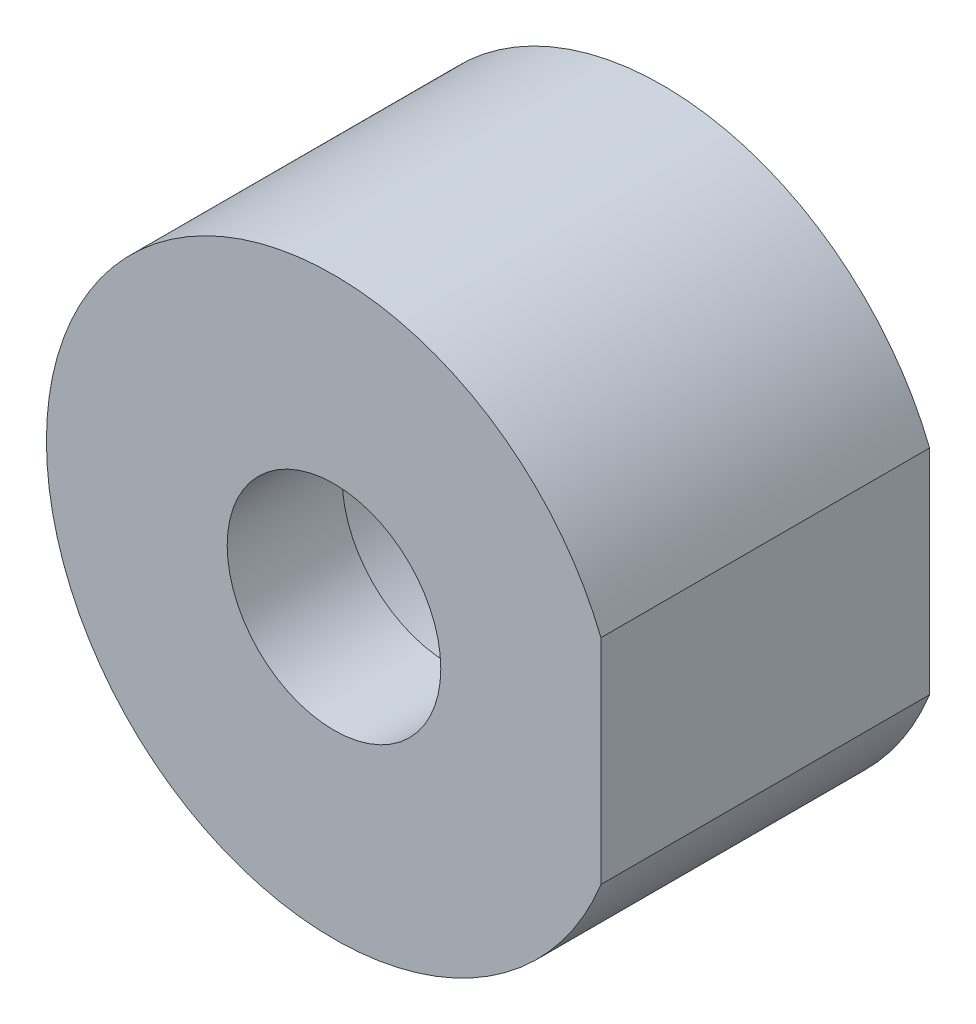
ISO-10303-21;
HEADER;
FILE_DESCRIPTION(('STEP AP214'),'2;1');
FILE_NAME('part.step','',(''),(''),'','','');
FILE_SCHEMA(('AUTOMOTIVE_DESIGN { 1 0 10303 214 1 1 1 1 }'));
ENDSEC;
DATA;
#1=APPLICATION_CONTEXT('core data for automotive mechanical design processes');
#2=APPLICATION_PROTOCOL_DEFINITION('international standard','automotive_design',2000,#1);
#3=PRODUCT_CONTEXT('',#1,'mechanical');
#4=PRODUCT('Part','Part','',(#3));
#5=PRODUCT_RELATED_PRODUCT_CATEGORY('part','',(#4));
#6=PRODUCT_DEFINITION_FORMATION('','',#4);
#7=PRODUCT_DEFINITION_CONTEXT('part definition',#1,'design');
#8=PRODUCT_DEFINITION('design','',#6,#7);
#9=PRODUCT_DEFINITION_SHAPE('','',#8);
#10=(LENGTH_UNIT() NAMED_UNIT(*) SI_UNIT(.MILLI.,.METRE.));
#11=(NAMED_UNIT(*) PLANE_ANGLE_UNIT() SI_UNIT($,.RADIAN.));
#12=(NAMED_UNIT(*) SI_UNIT($,.STERADIAN.) SOLID_ANGLE_UNIT());
#13=UNCERTAINTY_MEASURE_WITH_UNIT(LENGTH_MEASURE(1.E-05),#10,'distance_accuracy_value','');
#14=(GEOMETRIC_REPRESENTATION_CONTEXT(3) GLOBAL_UNCERTAINTY_ASSIGNED_CONTEXT((#13)) GLOBAL_UNIT_ASSIGNED_CONTEXT((#10,
#11,#12)) REPRESENTATION_CONTEXT('',''));
#15=CARTESIAN_POINT('',(0.,0.,0.));
#16=DIRECTION('',(0.,0.,1.));
#17=DIRECTION('',(1.,0.,0.));
#18=AXIS2_PLACEMENT_3D('',#15,#16,#17);
#19=CARTESIAN_POINT('',(0.,0.,8.));
#20=DIRECTION('',(0.,0.,-1.));
#21=DIRECTION('',(-1.,0.,0.));
#22=AXIS2_PLACEMENT_3D('',#19,#20,#21);
#23=CYLINDRICAL_SURFACE('',#22,7.);
#24=CARTESIAN_POINT('',(0.,0.,0.));
#25=DIRECTION('',(0.,0.,1.));
#26=DIRECTION('',(1.,0.,0.));
#27=AXIS2_PLACEMENT_3D('',#24,#25,#26);
#28=CIRCLE('',#27,7.);
#29=CARTESIAN_POINT('',(6.49867486492439,2.60138905202586,0.));
#30=VERTEX_POINT('',#29);
#31=CARTESIAN_POINT('',(6.49867486492439,-2.60138905202586,0.));
#32=VERTEX_POINT('',#31);
#33=EDGE_CURVE('E67',#30,#32,#28,.T.);
#34=ORIENTED_EDGE('',*,*,#33,.T.);
#35=DIRECTION('',(0.,0.,-1.));
#36=VECTOR('',#35,1.);
#37=CARTESIAN_POINT('',(6.49867486492439,-2.60138905202586,8.));
#38=LINE('',#37,#36);
#39=CARTESIAN_POINT('',(6.49867486492439,-2.60138905202586,8.));
#40=VERTEX_POINT('',#39);
#41=EDGE_CURVE('E11',#40,#32,#38,.T.);
#42=ORIENTED_EDGE('',*,*,#41,.F.);
#43=CARTESIAN_POINT('',(0.,0.,8.));
#44=DIRECTION('',(0.,0.,1.));
#45=DIRECTION('',(1.,0.,0.));
#46=AXIS2_PLACEMENT_3D('',#43,#44,#45);
#47=CIRCLE('',#46,7.);
#48=CARTESIAN_POINT('',(6.49867486492439,2.60138905202586,8.));
#49=VERTEX_POINT('',#48);
#50=EDGE_CURVE('E66',#49,#40,#47,.T.);
#51=ORIENTED_EDGE('',*,*,#50,.F.);
#52=DIRECTION('',(0.,0.,-1.));
#53=VECTOR('',#52,1.);
#54=CARTESIAN_POINT('',(6.49867486492439,2.60138905202586,8.));
#55=LINE('',#54,#53);
#56=EDGE_CURVE('E44',#49,#30,#55,.T.);
#57=ORIENTED_EDGE('',*,*,#56,.T.);
#58=EDGE_LOOP('',(#34,#42,#51,#57));
#59=FACE_BOUND('',#58,.T.);
#60=ADVANCED_FACE('F35',(#59),#23,.T.);
#61=CARTESIAN_POINT('',(6.49867486492439,-2.60138905202586,8.));
#62=DIRECTION('',(-1.,0.,0.));
#63=DIRECTION('',(0.,0.,1.));
#64=AXIS2_PLACEMENT_3D('',#61,#62,#63);
#65=PLANE('',#64);
#66=DIRECTION('',(0.,1.,0.));
#67=VECTOR('',#66,1.);
#68=CARTESIAN_POINT('',(6.49867486492439,-2.60138905202586,0.));
#69=LINE('',#68,#67);
#70=EDGE_CURVE('E59',#32,#30,#69,.T.);
#71=ORIENTED_EDGE('',*,*,#70,.T.);
#72=ORIENTED_EDGE('',*,*,#56,.F.);
#73=DIRECTION('',(0.,1.,0.));
#74=VECTOR('',#73,1.);
#75=CARTESIAN_POINT('',(6.49867486492439,-2.60138905202586,8.));
#76=LINE('',#75,#74);
#77=EDGE_CURVE('E51',#40,#49,#76,.T.);
#78=ORIENTED_EDGE('',*,*,#77,.F.);
#79=ORIENTED_EDGE('',*,*,#41,.T.);
#80=EDGE_LOOP('',(#71,#72,#78,#79));
#81=FACE_BOUND('',#80,.T.);
#82=ADVANCED_FACE('F62',(#81),#65,.F.);
#83=CARTESIAN_POINT('',(0.,0.,8.));
#84=DIRECTION('',(0.,0.,1.));
#85=DIRECTION('',(1.,0.,0.));
#86=AXIS2_PLACEMENT_3D('',#83,#84,#85);
#87=PLANE('',#86);
#88=CARTESIAN_POINT('',(0.,0.,8.));
#89=DIRECTION('',(0.,0.,1.));
#90=DIRECTION('',(1.,0.,0.));
#91=AXIS2_PLACEMENT_3D('',#88,#89,#90);
#92=CIRCLE('',#91,2.6);
#93=CARTESIAN_POINT('',(2.6,0.,8.));
#94=VERTEX_POINT('',#93);
#95=EDGE_CURVE('E38',#94,#94,#92,.T.);
#96=ORIENTED_EDGE('',*,*,#95,.F.);
#97=EDGE_LOOP('',(#96));
#98=FACE_BOUND('',#97,.T.);
#99=ORIENTED_EDGE('',*,*,#50,.T.);
#100=ORIENTED_EDGE('',*,*,#77,.T.);
#101=EDGE_LOOP('',(#99,#100));
#102=FACE_BOUND('',#101,.T.);
#103=ADVANCED_FACE('F91',(#98,#102),#87,.T.);
#104=CARTESIAN_POINT('',(0.,0.,0.));
#105=DIRECTION('',(0.,0.,1.));
#106=DIRECTION('',(1.,0.,0.));
#107=AXIS2_PLACEMENT_3D('',#104,#105,#106);
#108=PLANE('',#107);
#109=CARTESIAN_POINT('',(0.,0.,0.));
#110=DIRECTION('',(0.,0.,-1.));
#111=DIRECTION('',(-1.,0.,0.));
#112=AXIS2_PLACEMENT_3D('',#109,#110,#111);
#113=CIRCLE('',#112,3.95);
#114=CARTESIAN_POINT('',(-3.95,0.,0.));
#115=VERTEX_POINT('',#114);
#116=EDGE_CURVE('E75',#115,#115,#113,.T.);
#117=ORIENTED_EDGE('',*,*,#116,.F.);
#118=EDGE_LOOP('',(#117));
#119=FACE_BOUND('',#118,.T.);
#120=ORIENTED_EDGE('',*,*,#33,.F.);
#121=ORIENTED_EDGE('',*,*,#70,.F.);
#122=EDGE_LOOP('',(#120,#121));
#123=FACE_BOUND('',#122,.T.);
#124=ADVANCED_FACE('F71',(#119,#123),#108,.F.);
#125=CARTESIAN_POINT('',(0.,0.,5.2));
#126=DIRECTION('',(0.,0.,-1.));
#127=DIRECTION('',(-1.,0.,0.));
#128=AXIS2_PLACEMENT_3D('',#125,#126,#127);
#129=CYLINDRICAL_SURFACE('',#128,3.95);
#130=CARTESIAN_POINT('',(0.,0.,5.2));
#131=DIRECTION('',(0.,0.,-1.));
#132=DIRECTION('',(-1.,0.,0.));
#133=AXIS2_PLACEMENT_3D('',#130,#131,#132);
#134=CIRCLE('',#133,3.95);
#135=CARTESIAN_POINT('',(-3.95,0.,5.2));
#136=VERTEX_POINT('',#135);
#137=EDGE_CURVE('E72',#136,#136,#134,.T.);
#138=ORIENTED_EDGE('',*,*,#137,.F.);
#139=EDGE_LOOP('',(#138));
#140=FACE_BOUND('',#139,.T.);
#141=ORIENTED_EDGE('',*,*,#116,.T.);
#142=EDGE_LOOP('',(#141));
#143=FACE_BOUND('',#142,.T.);
#144=ADVANCED_FACE('F99',(#140,#143),#129,.F.);
#145=CARTESIAN_POINT('',(0.,0.,5.2));
#146=DIRECTION('',(0.,0.,-1.));
#147=DIRECTION('',(-1.,0.,0.));
#148=AXIS2_PLACEMENT_3D('',#145,#146,#147);
#149=PLANE('',#148);
#150=CARTESIAN_POINT('',(0.,0.,5.2));
#151=DIRECTION('',(0.,0.,-1.));
#152=DIRECTION('',(-1.,0.,0.));
#153=AXIS2_PLACEMENT_3D('',#150,#151,#152);
#154=CIRCLE('',#153,2.6);
#155=CARTESIAN_POINT('',(-2.6,0.,5.2));
#156=VERTEX_POINT('',#155);
#157=EDGE_CURVE('E82',#156,#156,#154,.T.);
#158=ORIENTED_EDGE('',*,*,#157,.F.);
#159=EDGE_LOOP('',(#158));
#160=FACE_BOUND('',#159,.T.);
#161=ORIENTED_EDGE('',*,*,#137,.T.);
#162=EDGE_LOOP('',(#161));
#163=FACE_BOUND('',#162,.T.);
#164=ADVANCED_FACE('F124',(#160,#163),#149,.T.);
#165=CARTESIAN_POINT('',(0.,0.,10.4));
#166=DIRECTION('',(0.,0.,-1.));
#167=DIRECTION('',(-1.,0.,0.));
#168=AXIS2_PLACEMENT_3D('',#165,#166,#167);
#169=CYLINDRICAL_SURFACE('',#168,2.6);
#170=ORIENTED_EDGE('',*,*,#95,.T.);
#171=EDGE_LOOP('',(#170));
#172=FACE_BOUND('',#171,.T.);
#173=ORIENTED_EDGE('',*,*,#157,.T.);
#174=EDGE_LOOP('',(#173));
#175=FACE_BOUND('',#174,.T.);
#176=ADVANCED_FACE('F89',(#172,#175),#169,.F.);
#177=CLOSED_SHELL('',(#60,#82,#103,#124,#144,#164,#176));
#178=MANIFOLD_SOLID_BREP('B2',#177);
#179=ADVANCED_BREP_SHAPE_REPRESENTATION('',(#18,#178),#14);
#180=SHAPE_DEFINITION_REPRESENTATION(#9,#179);
ENDSEC;
END-ISO-10303-21;
